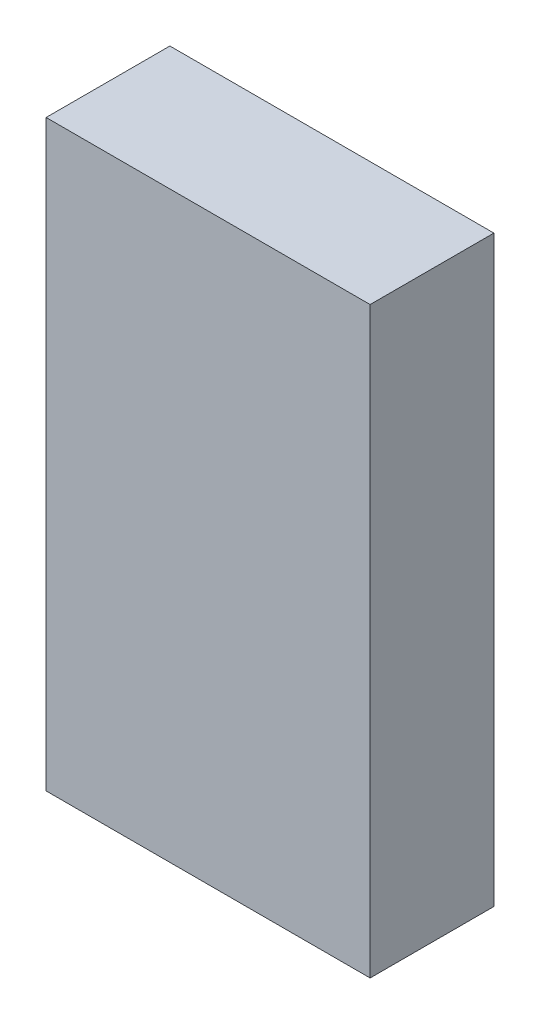
ISO-10303-21;
HEADER;
FILE_DESCRIPTION(('STEP AP214'),'2;1');
FILE_NAME('part.step','',(''),(''),'','','');
FILE_SCHEMA(('AUTOMOTIVE_DESIGN { 1 0 10303 214 1 1 1 1 }'));
ENDSEC;
DATA;
#1=APPLICATION_CONTEXT('core data for automotive mechanical design processes');
#2=APPLICATION_PROTOCOL_DEFINITION('international standard','automotive_design',2000,#1);
#3=PRODUCT_CONTEXT('',#1,'mechanical');
#4=PRODUCT('Part','Part','',(#3));
#5=PRODUCT_RELATED_PRODUCT_CATEGORY('part','',(#4));
#6=PRODUCT_DEFINITION_FORMATION('','',#4);
#7=PRODUCT_DEFINITION_CONTEXT('part definition',#1,'design');
#8=PRODUCT_DEFINITION('design','',#6,#7);
#9=PRODUCT_DEFINITION_SHAPE('','',#8);
#10=(LENGTH_UNIT() NAMED_UNIT(*) SI_UNIT(.MILLI.,.METRE.));
#11=(NAMED_UNIT(*) PLANE_ANGLE_UNIT() SI_UNIT($,.RADIAN.));
#12=(NAMED_UNIT(*) SI_UNIT($,.STERADIAN.) SOLID_ANGLE_UNIT());
#13=UNCERTAINTY_MEASURE_WITH_UNIT(LENGTH_MEASURE(1.E-05),#10,'distance_accuracy_value','');
#14=(GEOMETRIC_REPRESENTATION_CONTEXT(3) GLOBAL_UNCERTAINTY_ASSIGNED_CONTEXT((#13)) GLOBAL_UNIT_ASSIGNED_CONTEXT((#10,
#11,#12)) REPRESENTATION_CONTEXT('',''));
#15=CARTESIAN_POINT('',(0.,0.,0.));
#16=DIRECTION('',(0.,0.,1.));
#17=DIRECTION('',(1.,0.,0.));
#18=AXIS2_PLACEMENT_3D('',#15,#16,#17);
#19=CARTESIAN_POINT('',(1.,-8.725,2.16));
#20=DIRECTION('',(0.,0.,1.));
#21=DIRECTION('',(1.,0.,0.));
#22=AXIS2_PLACEMENT_3D('',#19,#20,#21);
#23=PLANE('',#22);
#24=DIRECTION('',(0.,1.,0.));
#25=VECTOR('',#24,1.);
#26=CARTESIAN_POINT('',(6.,-8.725,2.16));
#27=LINE('',#26,#25);
#28=CARTESIAN_POINT('',(6.,0.274999999999999,2.16));
#29=VERTEX_POINT('',#28);
#30=CARTESIAN_POINT('',(6.,-8.725,2.16));
#31=VERTEX_POINT('',#30);
#32=EDGE_CURVE('E76',#29,#31,#27,.F.);
#33=ORIENTED_EDGE('',*,*,#32,.F.);
#34=DIRECTION('',(1.,0.,0.));
#35=VECTOR('',#34,1.);
#36=CARTESIAN_POINT('',(1.,0.275,2.16));
#37=LINE('',#36,#35);
#38=CARTESIAN_POINT('',(1.,0.274999999999999,2.16));
#39=VERTEX_POINT('',#38);
#40=EDGE_CURVE('E58',#39,#29,#37,.T.);
#41=ORIENTED_EDGE('',*,*,#40,.F.);
#42=DIRECTION('',(0.,1.,0.));
#43=VECTOR('',#42,1.);
#44=CARTESIAN_POINT('',(1.,-8.725,2.16));
#45=LINE('',#44,#43);
#46=CARTESIAN_POINT('',(1.,-8.725,2.16));
#47=VERTEX_POINT('',#46);
#48=EDGE_CURVE('E20',#39,#47,#45,.F.);
#49=ORIENTED_EDGE('',*,*,#48,.T.);
#50=DIRECTION('',(1.,0.,0.));
#51=VECTOR('',#50,1.);
#52=CARTESIAN_POINT('',(1.,-8.725,2.16));
#53=LINE('',#52,#51);
#54=EDGE_CURVE('E55',#47,#31,#53,.T.);
#55=ORIENTED_EDGE('',*,*,#54,.T.);
#56=EDGE_LOOP('',(#33,#41,#49,#55));
#57=FACE_BOUND('',#56,.T.);
#58=ADVANCED_FACE('F17',(#57),#23,.T.);
#59=CARTESIAN_POINT('',(1.,-8.725,0.25));
#60=DIRECTION('',(1.,0.,0.));
#61=DIRECTION('',(0.,0.,-1.));
#62=AXIS2_PLACEMENT_3D('',#59,#60,#61);
#63=PLANE('',#62);
#64=DIRECTION('',(0.,0.,1.));
#65=VECTOR('',#64,1.);
#66=CARTESIAN_POINT('',(1.,0.275,0.25));
#67=LINE('',#66,#65);
#68=CARTESIAN_POINT('',(1.,0.274999999999999,0.25));
#69=VERTEX_POINT('',#68);
#70=EDGE_CURVE('E78',#69,#39,#67,.T.);
#71=ORIENTED_EDGE('',*,*,#70,.F.);
#72=DIRECTION('',(0.,1.,0.));
#73=VECTOR('',#72,1.);
#74=CARTESIAN_POINT('',(1.,-8.725,0.25));
#75=LINE('',#74,#73);
#76=CARTESIAN_POINT('',(1.,-8.725,0.25));
#77=VERTEX_POINT('',#76);
#78=EDGE_CURVE('E73',#69,#77,#75,.F.);
#79=ORIENTED_EDGE('',*,*,#78,.T.);
#80=DIRECTION('',(0.,0.,1.));
#81=VECTOR('',#80,1.);
#82=CARTESIAN_POINT('',(1.,-8.725,0.25));
#83=LINE('',#82,#81);
#84=EDGE_CURVE('E63',#77,#47,#83,.T.);
#85=ORIENTED_EDGE('',*,*,#84,.T.);
#86=ORIENTED_EDGE('',*,*,#48,.F.);
#87=EDGE_LOOP('',(#71,#79,#85,#86));
#88=FACE_BOUND('',#87,.T.);
#89=ADVANCED_FACE('F72',(#88),#63,.F.);
#90=CARTESIAN_POINT('',(1.,-8.725,0.25));
#91=DIRECTION('',(0.,1.,0.));
#92=DIRECTION('',(0.,0.,1.));
#93=AXIS2_PLACEMENT_3D('',#90,#91,#92);
#94=PLANE('',#93);
#95=ORIENTED_EDGE('',*,*,#54,.F.);
#96=ORIENTED_EDGE('',*,*,#84,.F.);
#97=DIRECTION('',(1.,0.,0.));
#98=VECTOR('',#97,1.);
#99=CARTESIAN_POINT('',(1.,-8.725,0.25));
#100=LINE('',#99,#98);
#101=CARTESIAN_POINT('',(6.,-8.725,0.25));
#102=VERTEX_POINT('',#101);
#103=EDGE_CURVE('E83',#77,#102,#100,.T.);
#104=ORIENTED_EDGE('',*,*,#103,.T.);
#105=DIRECTION('',(0.,0.,-1.));
#106=VECTOR('',#105,1.);
#107=CARTESIAN_POINT('',(6.,-8.725,0.25));
#108=LINE('',#107,#106);
#109=EDGE_CURVE('E69',#31,#102,#108,.T.);
#110=ORIENTED_EDGE('',*,*,#109,.F.);
#111=EDGE_LOOP('',(#95,#96,#104,#110));
#112=FACE_BOUND('',#111,.T.);
#113=ADVANCED_FACE('F66',(#112),#94,.F.);
#114=CARTESIAN_POINT('',(6.,-8.725,0.25));
#115=DIRECTION('',(1.,0.,0.));
#116=DIRECTION('',(0.,0.,-1.));
#117=AXIS2_PLACEMENT_3D('',#114,#115,#116);
#118=PLANE('',#117);
#119=DIRECTION('',(0.,0.,1.));
#120=VECTOR('',#119,1.);
#121=CARTESIAN_POINT('',(6.,0.275,0.25));
#122=LINE('',#121,#120);
#123=CARTESIAN_POINT('',(6.,0.274999999999999,0.25));
#124=VERTEX_POINT('',#123);
#125=EDGE_CURVE('E34',#29,#124,#122,.F.);
#126=ORIENTED_EDGE('',*,*,#125,.F.);
#127=ORIENTED_EDGE('',*,*,#32,.T.);
#128=ORIENTED_EDGE('',*,*,#109,.T.);
#129=DIRECTION('',(0.,1.,0.));
#130=VECTOR('',#129,1.);
#131=CARTESIAN_POINT('',(6.,-8.725,0.25));
#132=LINE('',#131,#130);
#133=EDGE_CURVE('E26',#102,#124,#132,.T.);
#134=ORIENTED_EDGE('',*,*,#133,.T.);
#135=EDGE_LOOP('',(#126,#127,#128,#134));
#136=FACE_BOUND('',#135,.T.);
#137=ADVANCED_FACE('F88',(#136),#118,.T.);
#138=CARTESIAN_POINT('',(1.,0.275,0.25));
#139=DIRECTION('',(0.,1.,0.));
#140=DIRECTION('',(0.,0.,1.));
#141=AXIS2_PLACEMENT_3D('',#138,#139,#140);
#142=PLANE('',#141);
#143=ORIENTED_EDGE('',*,*,#40,.T.);
#144=ORIENTED_EDGE('',*,*,#125,.T.);
#145=DIRECTION('',(1.,0.,0.));
#146=VECTOR('',#145,1.);
#147=CARTESIAN_POINT('',(1.,0.274999999999999,0.25));
#148=LINE('',#147,#146);
#149=EDGE_CURVE('E11',#124,#69,#148,.F.);
#150=ORIENTED_EDGE('',*,*,#149,.T.);
#151=ORIENTED_EDGE('',*,*,#70,.T.);
#152=EDGE_LOOP('',(#143,#144,#150,#151));
#153=FACE_BOUND('',#152,.T.);
#154=ADVANCED_FACE('F91',(#153),#142,.T.);
#155=CARTESIAN_POINT('',(1.,-8.725,0.25));
#156=DIRECTION('',(0.,0.,1.));
#157=DIRECTION('',(1.,0.,0.));
#158=AXIS2_PLACEMENT_3D('',#155,#156,#157);
#159=PLANE('',#158);
#160=ORIENTED_EDGE('',*,*,#133,.F.);
#161=ORIENTED_EDGE('',*,*,#103,.F.);
#162=ORIENTED_EDGE('',*,*,#78,.F.);
#163=ORIENTED_EDGE('',*,*,#149,.F.);
#164=EDGE_LOOP('',(#160,#161,#162,#163));
#165=FACE_BOUND('',#164,.T.);
#166=ADVANCED_FACE('F90',(#165),#159,.F.);
#167=CLOSED_SHELL('',(#58,#89,#113,#137,#154,#166));
#168=MANIFOLD_SOLID_BREP('B1',#167);
#169=ADVANCED_BREP_SHAPE_REPRESENTATION('',(#18,#168),#14);
#170=SHAPE_DEFINITION_REPRESENTATION(#9,#169);
ENDSEC;
END-ISO-10303-21;
